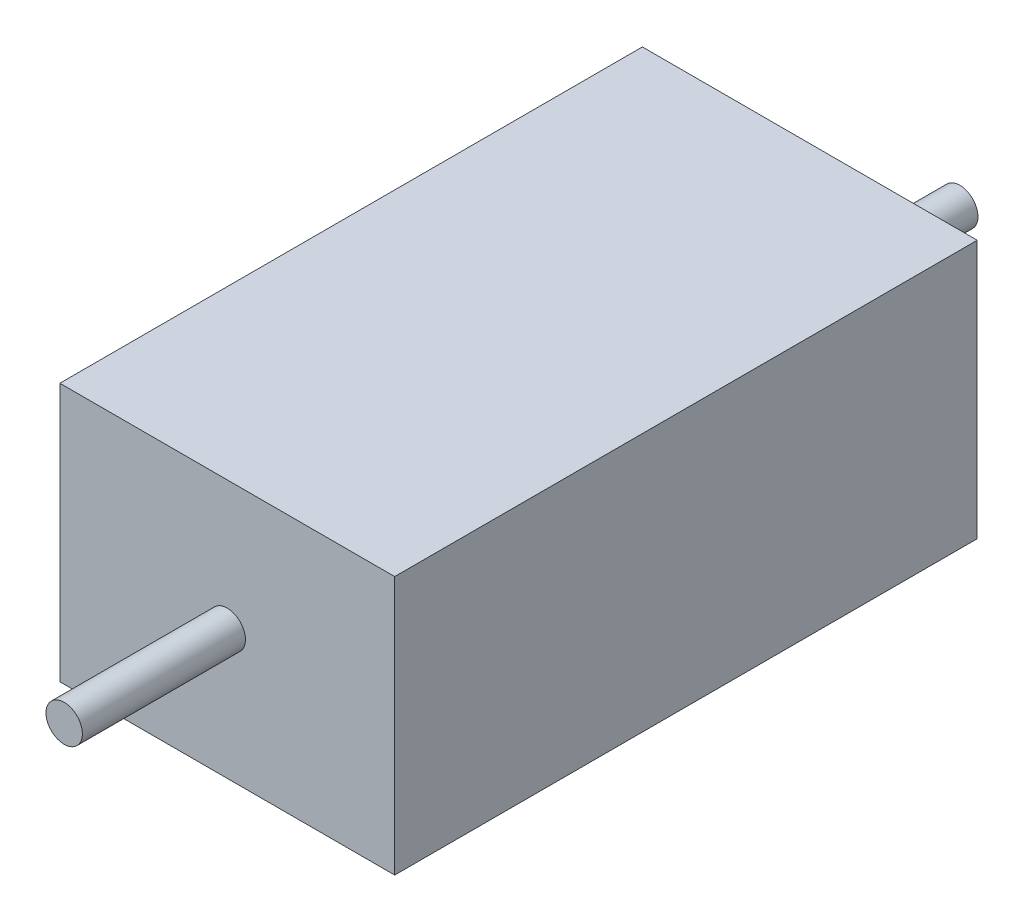
ISO-10303-21;
HEADER;
FILE_DESCRIPTION(('STEP AP214'),'2;1');
FILE_NAME('part.step','',(''),(''),'','','');
FILE_SCHEMA(('AUTOMOTIVE_DESIGN { 1 0 10303 214 1 1 1 1 }'));
ENDSEC;
DATA;
#1=APPLICATION_CONTEXT('core data for automotive mechanical design processes');
#2=APPLICATION_PROTOCOL_DEFINITION('international standard','automotive_design',2000,#1);
#3=PRODUCT_CONTEXT('',#1,'mechanical');
#4=PRODUCT('Part','Part','',(#3));
#5=PRODUCT_RELATED_PRODUCT_CATEGORY('part','',(#4));
#6=PRODUCT_DEFINITION_FORMATION('','',#4);
#7=PRODUCT_DEFINITION_CONTEXT('part definition',#1,'design');
#8=PRODUCT_DEFINITION('design','',#6,#7);
#9=PRODUCT_DEFINITION_SHAPE('','',#8);
#10=(LENGTH_UNIT() NAMED_UNIT(*) SI_UNIT(.MILLI.,.METRE.));
#11=(NAMED_UNIT(*) PLANE_ANGLE_UNIT() SI_UNIT($,.RADIAN.));
#12=(NAMED_UNIT(*) SI_UNIT($,.STERADIAN.) SOLID_ANGLE_UNIT());
#13=UNCERTAINTY_MEASURE_WITH_UNIT(LENGTH_MEASURE(1.E-05),#10,'distance_accuracy_value','');
#14=(GEOMETRIC_REPRESENTATION_CONTEXT(3) GLOBAL_UNCERTAINTY_ASSIGNED_CONTEXT((#13)) GLOBAL_UNIT_ASSIGNED_CONTEXT((#10,
#11,#12)) REPRESENTATION_CONTEXT('',''));
#15=CARTESIAN_POINT('',(0.,0.,0.));
#16=DIRECTION('',(0.,0.,1.));
#17=DIRECTION('',(1.,0.,0.));
#18=AXIS2_PLACEMENT_3D('',#15,#16,#17);
#19=CARTESIAN_POINT('',(259.624040603763,-258.843481964736,400.));
#20=DIRECTION('',(-1.,0.,0.));
#21=DIRECTION('',(0.,0.,1.));
#22=AXIS2_PLACEMENT_3D('',#19,#20,#21);
#23=PLANE('',#22);
#24=DIRECTION('',(0.,1.,0.));
#25=VECTOR('',#24,1.);
#26=CARTESIAN_POINT('',(259.624040603763,-258.843481964736,0.));
#27=LINE('',#26,#25);
#28=CARTESIAN_POINT('',(259.624040603763,-258.843481964736,0.));
#29=VERTEX_POINT('',#28);
#30=CARTESIAN_POINT('',(259.624040603763,-81.3287201643798,0.));
#31=VERTEX_POINT('',#30);
#32=EDGE_CURVE('E103',#29,#31,#27,.T.);
#33=ORIENTED_EDGE('',*,*,#32,.T.);
#34=DIRECTION('',(0.,0.,-1.));
#35=VECTOR('',#34,1.);
#36=CARTESIAN_POINT('',(259.624040603763,-81.3287201643798,400.));
#37=LINE('',#36,#35);
#38=CARTESIAN_POINT('',(259.624040603763,-81.3287201643798,400.));
#39=VERTEX_POINT('',#38);
#40=EDGE_CURVE('E45',#39,#31,#37,.T.);
#41=ORIENTED_EDGE('',*,*,#40,.F.);
#42=DIRECTION('',(0.,1.,0.));
#43=VECTOR('',#42,1.);
#44=CARTESIAN_POINT('',(259.624040603763,-258.843481964736,400.));
#45=LINE('',#44,#43);
#46=CARTESIAN_POINT('',(259.624040603763,-258.843481964736,400.));
#47=VERTEX_POINT('',#46);
#48=EDGE_CURVE('E89',#47,#39,#45,.T.);
#49=ORIENTED_EDGE('',*,*,#48,.F.);
#50=DIRECTION('',(0.,0.,-1.));
#51=VECTOR('',#50,1.);
#52=CARTESIAN_POINT('',(259.624040603763,-258.843481964736,400.));
#53=LINE('',#52,#51);
#54=EDGE_CURVE('E99',#47,#29,#53,.T.);
#55=ORIENTED_EDGE('',*,*,#54,.T.);
#56=EDGE_LOOP('',(#33,#41,#49,#55));
#57=FACE_BOUND('',#56,.T.);
#58=ADVANCED_FACE('F37',(#57),#23,.F.);
#59=CARTESIAN_POINT('',(29.7001586528253,-81.3287201643798,400.));
#60=DIRECTION('',(0.,-1.,0.));
#61=DIRECTION('',(0.,0.,-1.));
#62=AXIS2_PLACEMENT_3D('',#59,#60,#61);
#63=PLANE('',#62);
#64=DIRECTION('',(-1.,0.,0.));
#65=VECTOR('',#64,1.);
#66=CARTESIAN_POINT('',(29.7001586528253,-81.3287201643798,0.));
#67=LINE('',#66,#65);
#68=CARTESIAN_POINT('',(29.7001586528253,-81.3287201643798,0.));
#69=VERTEX_POINT('',#68);
#70=EDGE_CURVE('E94',#31,#69,#67,.T.);
#71=ORIENTED_EDGE('',*,*,#70,.T.);
#72=DIRECTION('',(0.,0.,-1.));
#73=VECTOR('',#72,1.);
#74=CARTESIAN_POINT('',(29.7001586528253,-81.3287201643798,400.));
#75=LINE('',#74,#73);
#76=CARTESIAN_POINT('',(29.7001586528253,-81.3287201643798,400.));
#77=VERTEX_POINT('',#76);
#78=EDGE_CURVE('E92',#77,#69,#75,.T.);
#79=ORIENTED_EDGE('',*,*,#78,.F.);
#80=DIRECTION('',(-1.,0.,0.));
#81=VECTOR('',#80,1.);
#82=CARTESIAN_POINT('',(29.7001586528253,-81.3287201643798,400.));
#83=LINE('',#82,#81);
#84=EDGE_CURVE('E84',#39,#77,#83,.T.);
#85=ORIENTED_EDGE('',*,*,#84,.F.);
#86=ORIENTED_EDGE('',*,*,#40,.T.);
#87=EDGE_LOOP('',(#71,#79,#85,#86));
#88=FACE_BOUND('',#87,.T.);
#89=ADVANCED_FACE('F93',(#88),#63,.F.);
#90=CARTESIAN_POINT('',(29.7001586528253,-258.843481964736,400.));
#91=DIRECTION('',(1.,0.,0.));
#92=DIRECTION('',(0.,0.,-1.));
#93=AXIS2_PLACEMENT_3D('',#90,#91,#92);
#94=PLANE('',#93);
#95=DIRECTION('',(0.,-1.,0.));
#96=VECTOR('',#95,1.);
#97=CARTESIAN_POINT('',(29.7001586528253,-258.843481964736,0.));
#98=LINE('',#97,#96);
#99=CARTESIAN_POINT('',(29.7001586528253,-258.843481964736,0.));
#100=VERTEX_POINT('',#99);
#101=EDGE_CURVE('E70',#69,#100,#98,.T.);
#102=ORIENTED_EDGE('',*,*,#101,.T.);
#103=DIRECTION('',(0.,0.,-1.));
#104=VECTOR('',#103,1.);
#105=CARTESIAN_POINT('',(29.7001586528253,-258.843481964736,400.));
#106=LINE('',#105,#104);
#107=CARTESIAN_POINT('',(29.7001586528253,-258.843481964736,400.));
#108=VERTEX_POINT('',#107);
#109=EDGE_CURVE('E95',#108,#100,#106,.T.);
#110=ORIENTED_EDGE('',*,*,#109,.F.);
#111=DIRECTION('',(0.,-1.,0.));
#112=VECTOR('',#111,1.);
#113=CARTESIAN_POINT('',(29.7001586528253,-258.843481964736,400.));
#114=LINE('',#113,#112);
#115=EDGE_CURVE('E87',#77,#108,#114,.T.);
#116=ORIENTED_EDGE('',*,*,#115,.F.);
#117=ORIENTED_EDGE('',*,*,#78,.T.);
#118=EDGE_LOOP('',(#102,#110,#116,#117));
#119=FACE_BOUND('',#118,.T.);
#120=ADVANCED_FACE('F97',(#119),#94,.F.);
#121=CARTESIAN_POINT('',(29.7001586528253,-258.843481964736,400.));
#122=DIRECTION('',(0.,1.,0.));
#123=DIRECTION('',(0.,0.,1.));
#124=AXIS2_PLACEMENT_3D('',#121,#122,#123);
#125=PLANE('',#124);
#126=DIRECTION('',(1.,0.,0.));
#127=VECTOR('',#126,1.);
#128=CARTESIAN_POINT('',(29.7001586528253,-258.843481964736,0.));
#129=LINE('',#128,#127);
#130=EDGE_CURVE('E76',#100,#29,#129,.T.);
#131=ORIENTED_EDGE('',*,*,#130,.T.);
#132=ORIENTED_EDGE('',*,*,#54,.F.);
#133=DIRECTION('',(1.,0.,0.));
#134=VECTOR('',#133,1.);
#135=CARTESIAN_POINT('',(29.7001586528253,-258.843481964736,400.));
#136=LINE('',#135,#134);
#137=EDGE_CURVE('E53',#108,#47,#136,.T.);
#138=ORIENTED_EDGE('',*,*,#137,.F.);
#139=ORIENTED_EDGE('',*,*,#109,.T.);
#140=EDGE_LOOP('',(#131,#132,#138,#139));
#141=FACE_BOUND('',#140,.T.);
#142=ADVANCED_FACE('F126',(#141),#125,.F.);
#143=CARTESIAN_POINT('',(0.,0.,400.));
#144=DIRECTION('',(0.,0.,-1.));
#145=DIRECTION('',(-1.,0.,0.));
#146=AXIS2_PLACEMENT_3D('',#143,#144,#145);
#147=PLANE('',#146);
#148=CARTESIAN_POINT('',(144.662099628294,-170.086101064558,400.));
#149=DIRECTION('',(0.,0.,-1.));
#150=DIRECTION('',(-1.,0.,0.));
#151=AXIS2_PLACEMENT_3D('',#148,#149,#150);
#152=CIRCLE('',#151,12.5);
#153=CARTESIAN_POINT('',(132.162099628294,-170.086101064558,400.));
#154=VERTEX_POINT('',#153);
#155=EDGE_CURVE('E106',#154,#154,#152,.T.);
#156=ORIENTED_EDGE('',*,*,#155,.T.);
#157=EDGE_LOOP('',(#156));
#158=FACE_BOUND('',#157,.T.);
#159=ORIENTED_EDGE('',*,*,#48,.T.);
#160=ORIENTED_EDGE('',*,*,#84,.T.);
#161=ORIENTED_EDGE('',*,*,#115,.T.);
#162=ORIENTED_EDGE('',*,*,#137,.T.);
#163=EDGE_LOOP('',(#159,#160,#161,#162));
#164=FACE_BOUND('',#163,.T.);
#165=ADVANCED_FACE('F85',(#158,#164),#147,.F.);
#166=CARTESIAN_POINT('',(0.,0.,0.));
#167=DIRECTION('',(0.,0.,-1.));
#168=DIRECTION('',(-1.,0.,0.));
#169=AXIS2_PLACEMENT_3D('',#166,#167,#168);
#170=PLANE('',#169);
#171=CARTESIAN_POINT('',(144.662099628294,-170.086101064558,0.));
#172=DIRECTION('',(0.,0.,-1.));
#173=DIRECTION('',(-1.,0.,0.));
#174=AXIS2_PLACEMENT_3D('',#171,#172,#173);
#175=CIRCLE('',#174,12.5);
#176=CARTESIAN_POINT('',(132.162099628294,-170.086101064558,0.));
#177=VERTEX_POINT('',#176);
#178=EDGE_CURVE('E11',#177,#177,#175,.T.);
#179=ORIENTED_EDGE('',*,*,#178,.F.);
#180=EDGE_LOOP('',(#179));
#181=FACE_BOUND('',#180,.T.);
#182=ORIENTED_EDGE('',*,*,#32,.F.);
#183=ORIENTED_EDGE('',*,*,#130,.F.);
#184=ORIENTED_EDGE('',*,*,#101,.F.);
#185=ORIENTED_EDGE('',*,*,#70,.F.);
#186=EDGE_LOOP('',(#182,#183,#184,#185));
#187=FACE_BOUND('',#186,.T.);
#188=ADVANCED_FACE('F114',(#181,#187),#170,.T.);
#189=CARTESIAN_POINT('',(144.662099628294,-170.086101064558,-103.));
#190=DIRECTION('',(0.,0.,1.));
#191=DIRECTION('',(1.,0.,0.));
#192=AXIS2_PLACEMENT_3D('',#189,#190,#191);
#193=PLANE('',#192);
#194=CARTESIAN_POINT('',(144.662099628294,-170.086101064558,-103.));
#195=DIRECTION('',(0.,0.,1.));
#196=DIRECTION('',(1.,0.,0.));
#197=AXIS2_PLACEMENT_3D('',#194,#195,#196);
#198=CIRCLE('',#197,12.5);
#199=CARTESIAN_POINT('',(157.162099628294,-170.086101064558,-103.));
#200=VERTEX_POINT('',#199);
#201=EDGE_CURVE('E227',#200,#200,#198,.T.);
#202=ORIENTED_EDGE('',*,*,#201,.F.);
#203=EDGE_LOOP('',(#202));
#204=FACE_BOUND('',#203,.T.);
#205=ADVANCED_FACE('F116',(#204),#193,.F.);
#206=CARTESIAN_POINT('',(144.662099628294,-170.086101064558,-103.));
#207=DIRECTION('',(0.,0.,1.));
#208=DIRECTION('',(1.,0.,0.));
#209=AXIS2_PLACEMENT_3D('',#206,#207,#208);
#210=CYLINDRICAL_SURFACE('',#209,12.5);
#211=ORIENTED_EDGE('',*,*,#178,.T.);
#212=EDGE_LOOP('',(#211));
#213=FACE_BOUND('',#212,.T.);
#214=ORIENTED_EDGE('',*,*,#201,.T.);
#215=EDGE_LOOP('',(#214));
#216=FACE_BOUND('',#215,.T.);
#217=ADVANCED_FACE('F123',(#213,#216),#210,.T.);
#218=CARTESIAN_POINT('',(144.662099628294,-170.086101064558,512.));
#219=DIRECTION('',(0.,0.,1.));
#220=DIRECTION('',(1.,0.,0.));
#221=AXIS2_PLACEMENT_3D('',#218,#219,#220);
#222=CIRCLE('',#221,12.5);
#223=CARTESIAN_POINT('',(157.162099628294,-170.086101064558,512.));
#224=VERTEX_POINT('',#223);
#225=EDGE_CURVE('E226',#224,#224,#222,.T.);
#226=ORIENTED_EDGE('',*,*,#225,.F.);
#227=EDGE_LOOP('',(#226));
#228=FACE_BOUND('',#227,.T.);
#229=ORIENTED_EDGE('',*,*,#155,.F.);
#230=EDGE_LOOP('',(#229));
#231=FACE_BOUND('',#230,.T.);
#232=ADVANCED_FACE('F170',(#228,#231),#210,.T.);
#233=CARTESIAN_POINT('',(144.662099628294,-170.086101064558,512.));
#234=DIRECTION('',(0.,0.,1.));
#235=DIRECTION('',(1.,0.,0.));
#236=AXIS2_PLACEMENT_3D('',#233,#234,#235);
#237=PLANE('',#236);
#238=ORIENTED_EDGE('',*,*,#225,.T.);
#239=EDGE_LOOP('',(#238));
#240=FACE_BOUND('',#239,.T.);
#241=ADVANCED_FACE('F181',(#240),#237,.T.);
#242=CLOSED_SHELL('',(#58,#89,#120,#142,#165,#188,#205,#217,#232,#241));
#243=MANIFOLD_SOLID_BREP('B2',#242);
#244=ADVANCED_BREP_SHAPE_REPRESENTATION('',(#18,#243),#14);
#245=SHAPE_DEFINITION_REPRESENTATION(#9,#244);
ENDSEC;
END-ISO-10303-21;
